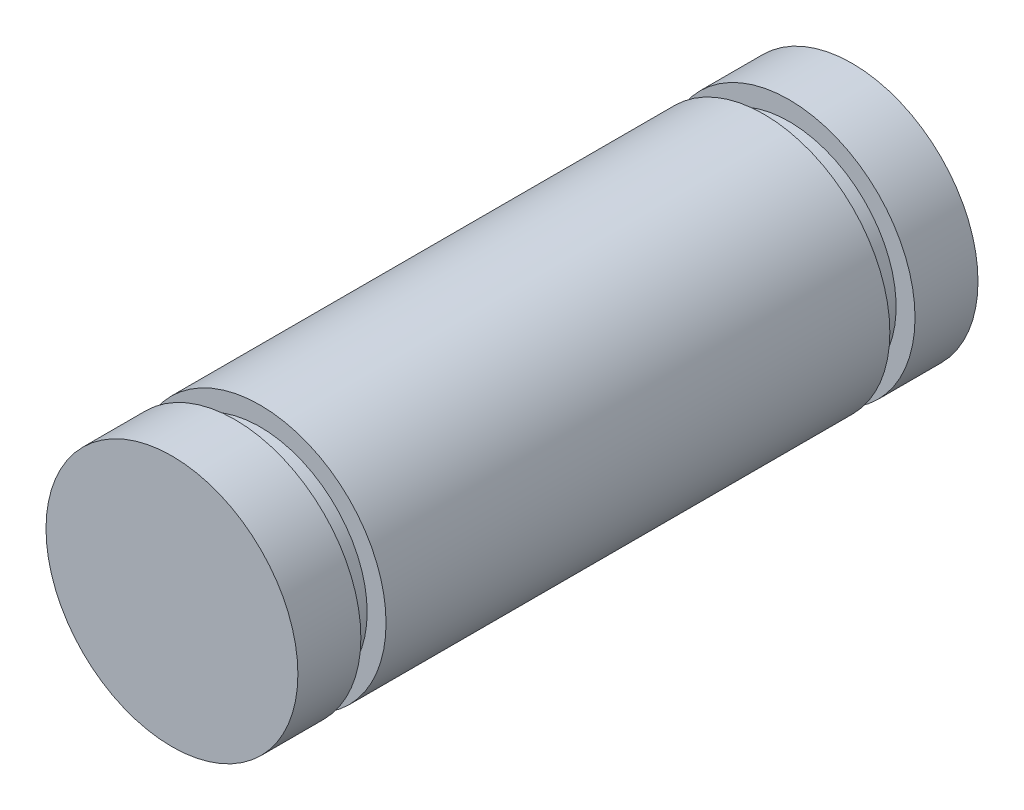
ISO-10303-21;
HEADER;
FILE_DESCRIPTION(('STEP AP214'),'2;1');
FILE_NAME('part.step','',(''),(''),'','','');
FILE_SCHEMA(('AUTOMOTIVE_DESIGN { 1 0 10303 214 1 1 1 1 }'));
ENDSEC;
DATA;
#1=APPLICATION_CONTEXT('core data for automotive mechanical design processes');
#2=APPLICATION_PROTOCOL_DEFINITION('international standard','automotive_design',2000,#1);
#3=PRODUCT_CONTEXT('',#1,'mechanical');
#4=PRODUCT('Part','Part','',(#3));
#5=PRODUCT_RELATED_PRODUCT_CATEGORY('part','',(#4));
#6=PRODUCT_DEFINITION_FORMATION('','',#4);
#7=PRODUCT_DEFINITION_CONTEXT('part definition',#1,'design');
#8=PRODUCT_DEFINITION('design','',#6,#7);
#9=PRODUCT_DEFINITION_SHAPE('','',#8);
#10=(LENGTH_UNIT() NAMED_UNIT(*) SI_UNIT(.MILLI.,.METRE.));
#11=(NAMED_UNIT(*) PLANE_ANGLE_UNIT() SI_UNIT($,.RADIAN.));
#12=(NAMED_UNIT(*) SI_UNIT($,.STERADIAN.) SOLID_ANGLE_UNIT());
#13=UNCERTAINTY_MEASURE_WITH_UNIT(LENGTH_MEASURE(1.E-05),#10,'distance_accuracy_value','');
#14=(GEOMETRIC_REPRESENTATION_CONTEXT(3) GLOBAL_UNCERTAINTY_ASSIGNED_CONTEXT((#13)) GLOBAL_UNIT_ASSIGNED_CONTEXT((#10,
#11,#12)) REPRESENTATION_CONTEXT('',''));
#15=CARTESIAN_POINT('',(0.,0.,0.));
#16=DIRECTION('',(0.,0.,1.));
#17=DIRECTION('',(1.,0.,0.));
#18=AXIS2_PLACEMENT_3D('',#15,#16,#17);
#19=CARTESIAN_POINT('',(0.,0.,40.));
#20=DIRECTION('',(0.,0.,-1.));
#21=DIRECTION('',(-1.,0.,0.));
#22=AXIS2_PLACEMENT_3D('',#19,#20,#21);
#23=CYLINDRICAL_SURFACE('',#22,10.);
#24=CARTESIAN_POINT('',(0.,0.,40.));
#25=DIRECTION('',(0.,0.,1.));
#26=DIRECTION('',(1.,0.,0.));
#27=AXIS2_PLACEMENT_3D('',#24,#25,#26);
#28=CIRCLE('',#27,10.);
#29=CARTESIAN_POINT('',(10.,0.,40.));
#30=VERTEX_POINT('',#29);
#31=EDGE_CURVE('E50',#30,#30,#28,.T.);
#32=ORIENTED_EDGE('',*,*,#31,.F.);
#33=EDGE_LOOP('',(#32));
#34=FACE_BOUND('',#33,.T.);
#35=CARTESIAN_POINT('',(0.,0.,0.));
#36=DIRECTION('',(0.,0.,1.));
#37=DIRECTION('',(1.,0.,0.));
#38=AXIS2_PLACEMENT_3D('',#35,#36,#37);
#39=CIRCLE('',#38,10.);
#40=CARTESIAN_POINT('',(10.,0.,0.));
#41=VERTEX_POINT('',#40);
#42=EDGE_CURVE('E41',#41,#41,#39,.T.);
#43=ORIENTED_EDGE('',*,*,#42,.T.);
#44=EDGE_LOOP('',(#43));
#45=FACE_BOUND('',#44,.T.);
#46=ADVANCED_FACE('F38',(#34,#45),#23,.T.);
#47=CARTESIAN_POINT('',(0.,0.,40.));
#48=DIRECTION('',(0.,0.,1.));
#49=DIRECTION('',(1.,0.,0.));
#50=AXIS2_PLACEMENT_3D('',#47,#48,#49);
#51=PLANE('',#50);
#52=CARTESIAN_POINT('',(0.,0.,40.));
#53=DIRECTION('',(0.,0.,1.));
#54=DIRECTION('',(1.,0.,0.));
#55=AXIS2_PLACEMENT_3D('',#52,#53,#54);
#56=CIRCLE('',#55,8.5);
#57=CARTESIAN_POINT('',(8.5,0.,40.));
#58=VERTEX_POINT('',#57);
#59=EDGE_CURVE('E45',#58,#58,#56,.T.);
#60=ORIENTED_EDGE('',*,*,#59,.F.);
#61=EDGE_LOOP('',(#60));
#62=FACE_BOUND('',#61,.T.);
#63=ORIENTED_EDGE('',*,*,#31,.T.);
#64=EDGE_LOOP('',(#63));
#65=FACE_BOUND('',#64,.T.);
#66=ADVANCED_FACE('F74',(#62,#65),#51,.T.);
#67=CARTESIAN_POINT('',(0.,0.,0.));
#68=DIRECTION('',(0.,0.,1.));
#69=DIRECTION('',(1.,0.,0.));
#70=AXIS2_PLACEMENT_3D('',#67,#68,#69);
#71=PLANE('',#70);
#72=CARTESIAN_POINT('',(0.,0.,0.));
#73=DIRECTION('',(0.,0.,-1.));
#74=DIRECTION('',(-1.,0.,0.));
#75=AXIS2_PLACEMENT_3D('',#72,#73,#74);
#76=CIRCLE('',#75,8.5);
#77=CARTESIAN_POINT('',(-8.5,0.,0.));
#78=VERTEX_POINT('',#77);
#79=EDGE_CURVE('E11',#78,#78,#76,.T.);
#80=ORIENTED_EDGE('',*,*,#79,.F.);
#81=EDGE_LOOP('',(#80));
#82=FACE_BOUND('',#81,.T.);
#83=ORIENTED_EDGE('',*,*,#42,.F.);
#84=EDGE_LOOP('',(#83));
#85=FACE_BOUND('',#84,.T.);
#86=ADVANCED_FACE('F71',(#82,#85),#71,.F.);
#87=CARTESIAN_POINT('',(0.,0.,42.));
#88=DIRECTION('',(0.,0.,-1.));
#89=DIRECTION('',(-1.,0.,0.));
#90=AXIS2_PLACEMENT_3D('',#87,#88,#89);
#91=CYLINDRICAL_SURFACE('',#90,8.5);
#92=CARTESIAN_POINT('',(0.,0.,42.));
#93=DIRECTION('',(0.,0.,1.));
#94=DIRECTION('',(1.,0.,0.));
#95=AXIS2_PLACEMENT_3D('',#92,#93,#94);
#96=CIRCLE('',#95,8.5);
#97=CARTESIAN_POINT('',(8.5,0.,42.));
#98=VERTEX_POINT('',#97);
#99=EDGE_CURVE('E59',#98,#98,#96,.T.);
#100=ORIENTED_EDGE('',*,*,#99,.F.);
#101=EDGE_LOOP('',(#100));
#102=FACE_BOUND('',#101,.T.);
#103=ORIENTED_EDGE('',*,*,#59,.T.);
#104=EDGE_LOOP('',(#103));
#105=FACE_BOUND('',#104,.T.);
#106=ADVANCED_FACE('F73',(#102,#105),#91,.T.);
#107=CARTESIAN_POINT('',(0.,0.,47.));
#108=DIRECTION('',(0.,0.,-1.));
#109=DIRECTION('',(-1.,0.,0.));
#110=AXIS2_PLACEMENT_3D('',#107,#108,#109);
#111=CYLINDRICAL_SURFACE('',#110,10.);
#112=CARTESIAN_POINT('',(0.,0.,47.));
#113=DIRECTION('',(0.,0.,1.));
#114=DIRECTION('',(1.,0.,0.));
#115=AXIS2_PLACEMENT_3D('',#112,#113,#114);
#116=CIRCLE('',#115,10.);
#117=CARTESIAN_POINT('',(10.,0.,47.));
#118=VERTEX_POINT('',#117);
#119=EDGE_CURVE('E56',#118,#118,#116,.T.);
#120=ORIENTED_EDGE('',*,*,#119,.F.);
#121=EDGE_LOOP('',(#120));
#122=FACE_BOUND('',#121,.T.);
#123=CARTESIAN_POINT('',(0.,0.,42.));
#124=DIRECTION('',(0.,0.,1.));
#125=DIRECTION('',(1.,0.,0.));
#126=AXIS2_PLACEMENT_3D('',#123,#124,#125);
#127=CIRCLE('',#126,10.);
#128=CARTESIAN_POINT('',(10.,0.,42.));
#129=VERTEX_POINT('',#128);
#130=EDGE_CURVE('E60',#129,#129,#127,.T.);
#131=ORIENTED_EDGE('',*,*,#130,.T.);
#132=EDGE_LOOP('',(#131));
#133=FACE_BOUND('',#132,.T.);
#134=ADVANCED_FACE('F80',(#122,#133),#111,.T.);
#135=CARTESIAN_POINT('',(0.,0.,47.));
#136=DIRECTION('',(0.,0.,1.));
#137=DIRECTION('',(1.,0.,0.));
#138=AXIS2_PLACEMENT_3D('',#135,#136,#137);
#139=PLANE('',#138);
#140=ORIENTED_EDGE('',*,*,#119,.T.);
#141=EDGE_LOOP('',(#140));
#142=FACE_BOUND('',#141,.T.);
#143=ADVANCED_FACE('F109',(#142),#139,.T.);
#144=CARTESIAN_POINT('',(0.,0.,42.));
#145=DIRECTION('',(0.,0.,1.));
#146=DIRECTION('',(1.,0.,0.));
#147=AXIS2_PLACEMENT_3D('',#144,#145,#146);
#148=PLANE('',#147);
#149=ORIENTED_EDGE('',*,*,#99,.T.);
#150=EDGE_LOOP('',(#149));
#151=FACE_BOUND('',#150,.T.);
#152=ORIENTED_EDGE('',*,*,#130,.F.);
#153=EDGE_LOOP('',(#152));
#154=FACE_BOUND('',#153,.T.);
#155=ADVANCED_FACE('F119',(#151,#154),#148,.F.);
#156=CARTESIAN_POINT('',(0.,0.,-2.));
#157=DIRECTION('',(0.,0.,1.));
#158=DIRECTION('',(1.,0.,0.));
#159=AXIS2_PLACEMENT_3D('',#156,#157,#158);
#160=CYLINDRICAL_SURFACE('',#159,8.5);
#161=CARTESIAN_POINT('',(0.,0.,-2.));
#162=DIRECTION('',(0.,0.,-1.));
#163=DIRECTION('',(-1.,0.,0.));
#164=AXIS2_PLACEMENT_3D('',#161,#162,#163);
#165=CIRCLE('',#164,8.5);
#166=CARTESIAN_POINT('',(-8.5,0.,-2.));
#167=VERTEX_POINT('',#166);
#168=EDGE_CURVE('E54',#167,#167,#165,.T.);
#169=ORIENTED_EDGE('',*,*,#168,.F.);
#170=EDGE_LOOP('',(#169));
#171=FACE_BOUND('',#170,.T.);
#172=ORIENTED_EDGE('',*,*,#79,.T.);
#173=EDGE_LOOP('',(#172));
#174=FACE_BOUND('',#173,.T.);
#175=ADVANCED_FACE('F128',(#171,#174),#160,.T.);
#176=CARTESIAN_POINT('',(0.,0.,-7.));
#177=DIRECTION('',(0.,0.,1.));
#178=DIRECTION('',(1.,0.,0.));
#179=AXIS2_PLACEMENT_3D('',#176,#177,#178);
#180=CYLINDRICAL_SURFACE('',#179,10.);
#181=CARTESIAN_POINT('',(0.,0.,-7.));
#182=DIRECTION('',(0.,0.,-1.));
#183=DIRECTION('',(-1.,0.,0.));
#184=AXIS2_PLACEMENT_3D('',#181,#182,#183);
#185=CIRCLE('',#184,10.);
#186=CARTESIAN_POINT('',(-10.,0.,-7.));
#187=VERTEX_POINT('',#186);
#188=EDGE_CURVE('E183',#187,#187,#185,.T.);
#189=ORIENTED_EDGE('',*,*,#188,.F.);
#190=EDGE_LOOP('',(#189));
#191=FACE_BOUND('',#190,.T.);
#192=CARTESIAN_POINT('',(0.,0.,-2.));
#193=DIRECTION('',(0.,0.,-1.));
#194=DIRECTION('',(-1.,0.,0.));
#195=AXIS2_PLACEMENT_3D('',#192,#193,#194);
#196=CIRCLE('',#195,10.);
#197=CARTESIAN_POINT('',(-10.,0.,-2.));
#198=VERTEX_POINT('',#197);
#199=EDGE_CURVE('E181',#198,#198,#196,.T.);
#200=ORIENTED_EDGE('',*,*,#199,.T.);
#201=EDGE_LOOP('',(#200));
#202=FACE_BOUND('',#201,.T.);
#203=ADVANCED_FACE('F142',(#191,#202),#180,.T.);
#204=CARTESIAN_POINT('',(0.,0.,-7.));
#205=DIRECTION('',(0.,0.,-1.));
#206=DIRECTION('',(-1.,0.,0.));
#207=AXIS2_PLACEMENT_3D('',#204,#205,#206);
#208=PLANE('',#207);
#209=ORIENTED_EDGE('',*,*,#188,.T.);
#210=EDGE_LOOP('',(#209));
#211=FACE_BOUND('',#210,.T.);
#212=ADVANCED_FACE('F152',(#211),#208,.T.);
#213=CARTESIAN_POINT('',(0.,0.,-2.));
#214=DIRECTION('',(0.,0.,-1.));
#215=DIRECTION('',(-1.,0.,0.));
#216=AXIS2_PLACEMENT_3D('',#213,#214,#215);
#217=PLANE('',#216);
#218=ORIENTED_EDGE('',*,*,#168,.T.);
#219=EDGE_LOOP('',(#218));
#220=FACE_BOUND('',#219,.T.);
#221=ORIENTED_EDGE('',*,*,#199,.F.);
#222=EDGE_LOOP('',(#221));
#223=FACE_BOUND('',#222,.T.);
#224=ADVANCED_FACE('F162',(#220,#223),#217,.F.);
#225=CLOSED_SHELL('',(#46,#66,#86,#106,#134,#143,#155,#175,#203,#212,#224));
#226=MANIFOLD_SOLID_BREP('B2',#225);
#227=ADVANCED_BREP_SHAPE_REPRESENTATION('',(#18,#226),#14);
#228=SHAPE_DEFINITION_REPRESENTATION(#9,#227);
ENDSEC;
END-ISO-10303-21;
